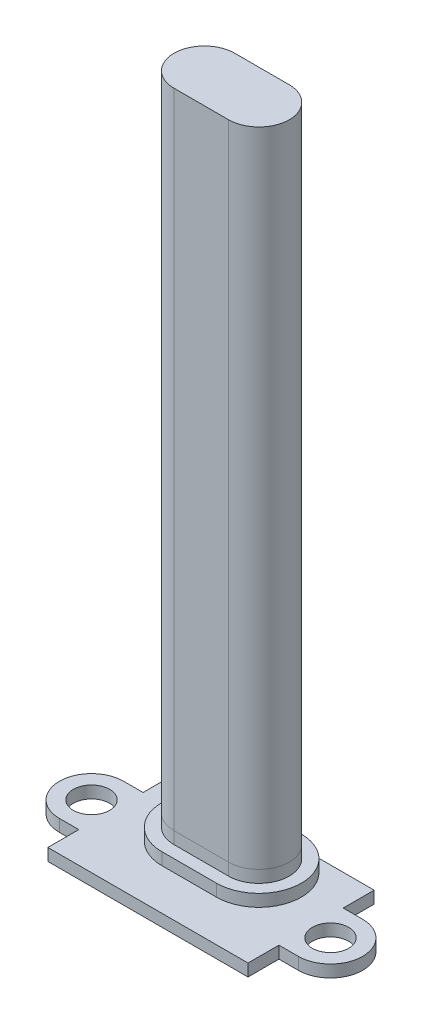
ISO-10303-21;
HEADER;
FILE_DESCRIPTION(('STEP AP214'),'2;1');
FILE_NAME('part.step','',(''),(''),'','','');
FILE_SCHEMA(('AUTOMOTIVE_DESIGN { 1 0 10303 214 1 1 1 1 }'));
ENDSEC;
DATA;
#1=APPLICATION_CONTEXT('core data for automotive mechanical design processes');
#2=APPLICATION_PROTOCOL_DEFINITION('international standard','automotive_design',2000,#1);
#3=PRODUCT_CONTEXT('',#1,'mechanical');
#4=PRODUCT('Part','Part','',(#3));
#5=PRODUCT_RELATED_PRODUCT_CATEGORY('part','',(#4));
#6=PRODUCT_DEFINITION_FORMATION('','',#4);
#7=PRODUCT_DEFINITION_CONTEXT('part definition',#1,'design');
#8=PRODUCT_DEFINITION('design','',#6,#7);
#9=PRODUCT_DEFINITION_SHAPE('','',#8);
#10=(LENGTH_UNIT() NAMED_UNIT(*) SI_UNIT(.MILLI.,.METRE.));
#11=(NAMED_UNIT(*) PLANE_ANGLE_UNIT() SI_UNIT($,.RADIAN.));
#12=(NAMED_UNIT(*) SI_UNIT($,.STERADIAN.) SOLID_ANGLE_UNIT());
#13=UNCERTAINTY_MEASURE_WITH_UNIT(LENGTH_MEASURE(1.E-05),#10,'distance_accuracy_value','');
#14=(GEOMETRIC_REPRESENTATION_CONTEXT(3) GLOBAL_UNCERTAINTY_ASSIGNED_CONTEXT((#13)) GLOBAL_UNIT_ASSIGNED_CONTEXT((#10,
#11,#12)) REPRESENTATION_CONTEXT('',''));
#15=CARTESIAN_POINT('',(0.,0.,0.));
#16=DIRECTION('',(0.,0.,1.));
#17=DIRECTION('',(1.,0.,0.));
#18=AXIS2_PLACEMENT_3D('',#15,#16,#17);
#19=CARTESIAN_POINT('',(-2.25,56.,-6.9));
#20=DIRECTION('',(0.,-1.,0.));
#21=DIRECTION('',(0.,0.,-1.));
#22=AXIS2_PLACEMENT_3D('',#19,#20,#21);
#23=CYLINDRICAL_SURFACE('',#22,2.5);
#24=CARTESIAN_POINT('',(-2.25,3.,-6.9));
#25=DIRECTION('',(0.,1.,0.));
#26=DIRECTION('',(0.,0.,1.));
#27=AXIS2_PLACEMENT_3D('',#24,#25,#26);
#28=CIRCLE('',#27,2.5);
#29=CARTESIAN_POINT('',(-2.25,3.,-9.4));
#30=VERTEX_POINT('',#29);
#31=CARTESIAN_POINT('',(-2.25,3.,-4.4));
#32=VERTEX_POINT('',#31);
#33=EDGE_CURVE('E118',#30,#32,#28,.T.);
#34=ORIENTED_EDGE('',*,*,#33,.T.);
#35=DIRECTION('',(0.,-1.,0.));
#36=VECTOR('',#35,1.);
#37=CARTESIAN_POINT('',(-2.25,56.,-4.4));
#38=LINE('',#37,#36);
#39=CARTESIAN_POINT('',(-2.25,56.,-4.4));
#40=VERTEX_POINT('',#39);
#41=EDGE_CURVE('E12',#40,#32,#38,.T.);
#42=ORIENTED_EDGE('',*,*,#41,.F.);
#43=CARTESIAN_POINT('',(-2.25,56.,-6.9));
#44=DIRECTION('',(0.,1.,0.));
#45=DIRECTION('',(0.,0.,1.));
#46=AXIS2_PLACEMENT_3D('',#43,#44,#45);
#47=CIRCLE('',#46,2.5);
#48=CARTESIAN_POINT('',(-2.25,56.,-9.4));
#49=VERTEX_POINT('',#48);
#50=EDGE_CURVE('E106',#49,#40,#47,.T.);
#51=ORIENTED_EDGE('',*,*,#50,.F.);
#52=DIRECTION('',(0.,-1.,0.));
#53=VECTOR('',#52,1.);
#54=CARTESIAN_POINT('',(-2.25,56.,-9.4));
#55=LINE('',#54,#53);
#56=EDGE_CURVE('E114',#49,#30,#55,.T.);
#57=ORIENTED_EDGE('',*,*,#56,.T.);
#58=EDGE_LOOP('',(#34,#42,#51,#57));
#59=FACE_BOUND('',#58,.T.);
#60=ADVANCED_FACE('F55',(#59),#23,.T.);
#61=CARTESIAN_POINT('',(-2.25,56.,-4.4));
#62=DIRECTION('',(0.,0.,-1.));
#63=DIRECTION('',(-1.,0.,0.));
#64=AXIS2_PLACEMENT_3D('',#61,#62,#63);
#65=PLANE('',#64);
#66=DIRECTION('',(1.,0.,0.));
#67=VECTOR('',#66,1.);
#68=CARTESIAN_POINT('',(-2.25,3.,-4.4));
#69=LINE('',#68,#67);
#70=CARTESIAN_POINT('',(2.25,3.,-4.4));
#71=VERTEX_POINT('',#70);
#72=EDGE_CURVE('E110',#32,#71,#69,.T.);
#73=ORIENTED_EDGE('',*,*,#72,.T.);
#74=DIRECTION('',(0.,-1.,0.));
#75=VECTOR('',#74,1.);
#76=CARTESIAN_POINT('',(2.25,56.,-4.4));
#77=LINE('',#76,#75);
#78=CARTESIAN_POINT('',(2.25,56.,-4.4));
#79=VERTEX_POINT('',#78);
#80=EDGE_CURVE('E63',#79,#71,#77,.T.);
#81=ORIENTED_EDGE('',*,*,#80,.F.);
#82=DIRECTION('',(1.,0.,0.));
#83=VECTOR('',#82,1.);
#84=CARTESIAN_POINT('',(-2.25,56.,-4.4));
#85=LINE('',#84,#83);
#86=EDGE_CURVE('E101',#40,#79,#85,.T.);
#87=ORIENTED_EDGE('',*,*,#86,.F.);
#88=ORIENTED_EDGE('',*,*,#41,.T.);
#89=EDGE_LOOP('',(#73,#81,#87,#88));
#90=FACE_BOUND('',#89,.T.);
#91=ADVANCED_FACE('F109',(#90),#65,.F.);
#92=CARTESIAN_POINT('',(2.25,56.,-6.9));
#93=DIRECTION('',(0.,-1.,0.));
#94=DIRECTION('',(0.,0.,-1.));
#95=AXIS2_PLACEMENT_3D('',#92,#93,#94);
#96=CYLINDRICAL_SURFACE('',#95,2.5);
#97=CARTESIAN_POINT('',(2.25,3.,-6.9));
#98=DIRECTION('',(0.,1.,0.));
#99=DIRECTION('',(0.,0.,1.));
#100=AXIS2_PLACEMENT_3D('',#97,#98,#99);
#101=CIRCLE('',#100,2.5);
#102=CARTESIAN_POINT('',(2.25,3.,-9.4));
#103=VERTEX_POINT('',#102);
#104=EDGE_CURVE('E88',#71,#103,#101,.T.);
#105=ORIENTED_EDGE('',*,*,#104,.T.);
#106=DIRECTION('',(0.,-1.,0.));
#107=VECTOR('',#106,1.);
#108=CARTESIAN_POINT('',(2.25,56.,-9.4));
#109=LINE('',#108,#107);
#110=CARTESIAN_POINT('',(2.25,56.,-9.4));
#111=VERTEX_POINT('',#110);
#112=EDGE_CURVE('E111',#111,#103,#109,.T.);
#113=ORIENTED_EDGE('',*,*,#112,.F.);
#114=CARTESIAN_POINT('',(2.25,56.,-6.9));
#115=DIRECTION('',(0.,1.,0.));
#116=DIRECTION('',(0.,0.,1.));
#117=AXIS2_PLACEMENT_3D('',#114,#115,#116);
#118=CIRCLE('',#117,2.5);
#119=EDGE_CURVE('E104',#79,#111,#118,.T.);
#120=ORIENTED_EDGE('',*,*,#119,.F.);
#121=ORIENTED_EDGE('',*,*,#80,.T.);
#122=EDGE_LOOP('',(#105,#113,#120,#121));
#123=FACE_BOUND('',#122,.T.);
#124=ADVANCED_FACE('F112',(#123),#96,.T.);
#125=CARTESIAN_POINT('',(2.25,56.,-9.4));
#126=DIRECTION('',(0.,0.,1.));
#127=DIRECTION('',(1.,0.,0.));
#128=AXIS2_PLACEMENT_3D('',#125,#126,#127);
#129=PLANE('',#128);
#130=DIRECTION('',(-1.,0.,0.));
#131=VECTOR('',#130,1.);
#132=CARTESIAN_POINT('',(2.25,3.,-9.4));
#133=LINE('',#132,#131);
#134=EDGE_CURVE('E94',#103,#30,#133,.T.);
#135=ORIENTED_EDGE('',*,*,#134,.T.);
#136=ORIENTED_EDGE('',*,*,#56,.F.);
#137=DIRECTION('',(-1.,0.,0.));
#138=VECTOR('',#137,1.);
#139=CARTESIAN_POINT('',(2.25,56.,-9.4));
#140=LINE('',#139,#138);
#141=EDGE_CURVE('E71',#111,#49,#140,.T.);
#142=ORIENTED_EDGE('',*,*,#141,.F.);
#143=ORIENTED_EDGE('',*,*,#112,.T.);
#144=EDGE_LOOP('',(#135,#136,#142,#143));
#145=FACE_BOUND('',#144,.T.);
#146=ADVANCED_FACE('F125',(#145),#129,.F.);
#147=CARTESIAN_POINT('',(-2.25,56.,-6.9));
#148=DIRECTION('',(0.,1.,0.));
#149=DIRECTION('',(0.,0.,1.));
#150=AXIS2_PLACEMENT_3D('',#147,#148,#149);
#151=PLANE('',#150);
#152=ORIENTED_EDGE('',*,*,#50,.T.);
#153=ORIENTED_EDGE('',*,*,#86,.T.);
#154=ORIENTED_EDGE('',*,*,#119,.T.);
#155=ORIENTED_EDGE('',*,*,#141,.T.);
#156=EDGE_LOOP('',(#152,#153,#154,#155));
#157=FACE_BOUND('',#156,.T.);
#158=ADVANCED_FACE('F102',(#157),#151,.T.);
#159=CARTESIAN_POINT('',(-2.25,3.,-6.9));
#160=DIRECTION('',(0.,1.,0.));
#161=DIRECTION('',(0.,0.,1.));
#162=AXIS2_PLACEMENT_3D('',#159,#160,#161);
#163=PLANE('',#162);
#164=ORIENTED_EDGE('',*,*,#33,.F.);
#165=ORIENTED_EDGE('',*,*,#134,.F.);
#166=ORIENTED_EDGE('',*,*,#104,.F.);
#167=ORIENTED_EDGE('',*,*,#72,.F.);
#168=EDGE_LOOP('',(#164,#165,#166,#167));
#169=FACE_BOUND('',#168,.T.);
#170=ADVANCED_FACE('F128',(#169),#163,.F.);
#171=CLOSED_SHELL('',(#60,#91,#124,#146,#158,#170));
#172=MANIFOLD_SOLID_BREP('B2_NOT_SHOWN',#171);
#173=CARTESIAN_POINT('',(-2.25,2.,-6.9));
#174=DIRECTION('',(0.,-1.,0.));
#175=DIRECTION('',(0.,0.,-1.));
#176=AXIS2_PLACEMENT_3D('',#173,#174,#175);
#177=CYLINDRICAL_SURFACE('',#176,3.5);
#178=CARTESIAN_POINT('',(-2.25,1.,-6.9));
#179=DIRECTION('',(0.,1.,0.));
#180=DIRECTION('',(0.,0.,1.));
#181=AXIS2_PLACEMENT_3D('',#178,#179,#180);
#182=CIRCLE('',#181,3.5);
#183=CARTESIAN_POINT('',(-2.25,1.,-10.4));
#184=VERTEX_POINT('',#183);
#185=CARTESIAN_POINT('',(-2.25,1.,-3.4));
#186=VERTEX_POINT('',#185);
#187=EDGE_CURVE('E283',#184,#186,#182,.T.);
#188=ORIENTED_EDGE('',*,*,#187,.T.);
#189=DIRECTION('',(0.,-1.,0.));
#190=VECTOR('',#189,1.);
#191=CARTESIAN_POINT('',(-2.25,2.,-3.4));
#192=LINE('',#191,#190);
#193=CARTESIAN_POINT('',(-2.25,2.,-3.4));
#194=VERTEX_POINT('',#193);
#195=EDGE_CURVE('E53',#194,#186,#192,.T.);
#196=ORIENTED_EDGE('',*,*,#195,.F.);
#197=CARTESIAN_POINT('',(-2.25,2.,-6.9));
#198=DIRECTION('',(0.,1.,0.));
#199=DIRECTION('',(0.,0.,1.));
#200=AXIS2_PLACEMENT_3D('',#197,#198,#199);
#201=CIRCLE('',#200,3.5);
#202=CARTESIAN_POINT('',(-2.25,2.,-10.4));
#203=VERTEX_POINT('',#202);
#204=EDGE_CURVE('E292',#203,#194,#201,.T.);
#205=ORIENTED_EDGE('',*,*,#204,.F.);
#206=DIRECTION('',(0.,-1.,0.));
#207=VECTOR('',#206,1.);
#208=CARTESIAN_POINT('',(-2.25,2.,-10.4));
#209=LINE('',#208,#207);
#210=EDGE_CURVE('E301',#203,#184,#209,.T.);
#211=ORIENTED_EDGE('',*,*,#210,.T.);
#212=EDGE_LOOP('',(#188,#196,#205,#211));
#213=FACE_BOUND('',#212,.T.);
#214=ADVANCED_FACE('F199',(#213),#177,.T.);
#215=CARTESIAN_POINT('',(-2.25,2.,-3.4));
#216=DIRECTION('',(0.,0.,-1.));
#217=DIRECTION('',(-1.,0.,0.));
#218=AXIS2_PLACEMENT_3D('',#215,#216,#217);
#219=PLANE('',#218);
#220=DIRECTION('',(1.,0.,0.));
#221=VECTOR('',#220,1.);
#222=CARTESIAN_POINT('',(-2.25,1.,-3.4));
#223=LINE('',#222,#221);
#224=CARTESIAN_POINT('',(2.25,1.,-3.4));
#225=VERTEX_POINT('',#224);
#226=EDGE_CURVE('E286',#186,#225,#223,.T.);
#227=ORIENTED_EDGE('',*,*,#226,.T.);
#228=DIRECTION('',(0.,-1.,0.));
#229=VECTOR('',#228,1.);
#230=CARTESIAN_POINT('',(2.25,2.,-3.4));
#231=LINE('',#230,#229);
#232=CARTESIAN_POINT('',(2.25,2.,-3.4));
#233=VERTEX_POINT('',#232);
#234=EDGE_CURVE('E206',#233,#225,#231,.T.);
#235=ORIENTED_EDGE('',*,*,#234,.F.);
#236=DIRECTION('',(1.,0.,0.));
#237=VECTOR('',#236,1.);
#238=CARTESIAN_POINT('',(-2.25,2.,-3.4));
#239=LINE('',#238,#237);
#240=EDGE_CURVE('E295',#194,#233,#239,.T.);
#241=ORIENTED_EDGE('',*,*,#240,.F.);
#242=ORIENTED_EDGE('',*,*,#195,.T.);
#243=EDGE_LOOP('',(#227,#235,#241,#242));
#244=FACE_BOUND('',#243,.T.);
#245=ADVANCED_FACE('F332',(#244),#219,.F.);
#246=CARTESIAN_POINT('',(2.25,2.,-6.9));
#247=DIRECTION('',(0.,-1.,0.));
#248=DIRECTION('',(0.,0.,-1.));
#249=AXIS2_PLACEMENT_3D('',#246,#247,#248);
#250=CYLINDRICAL_SURFACE('',#249,3.5);
#251=CARTESIAN_POINT('',(2.25,1.,-6.9));
#252=DIRECTION('',(0.,1.,0.));
#253=DIRECTION('',(0.,0.,1.));
#254=AXIS2_PLACEMENT_3D('',#251,#252,#253);
#255=CIRCLE('',#254,3.5);
#256=CARTESIAN_POINT('',(2.25,1.,-10.4));
#257=VERTEX_POINT('',#256);
#258=EDGE_CURVE('E304',#225,#257,#255,.T.);
#259=ORIENTED_EDGE('',*,*,#258,.T.);
#260=DIRECTION('',(0.,-1.,0.));
#261=VECTOR('',#260,1.);
#262=CARTESIAN_POINT('',(2.25,2.,-10.4));
#263=LINE('',#262,#261);
#264=CARTESIAN_POINT('',(2.25,2.,-10.4));
#265=VERTEX_POINT('',#264);
#266=EDGE_CURVE('E309',#265,#257,#263,.T.);
#267=ORIENTED_EDGE('',*,*,#266,.F.);
#268=CARTESIAN_POINT('',(2.25,2.,-6.9));
#269=DIRECTION('',(0.,1.,0.));
#270=DIRECTION('',(0.,0.,1.));
#271=AXIS2_PLACEMENT_3D('',#268,#269,#270);
#272=CIRCLE('',#271,3.5);
#273=EDGE_CURVE('E298',#233,#265,#272,.T.);
#274=ORIENTED_EDGE('',*,*,#273,.F.);
#275=ORIENTED_EDGE('',*,*,#234,.T.);
#276=EDGE_LOOP('',(#259,#267,#274,#275));
#277=FACE_BOUND('',#276,.T.);
#278=ADVANCED_FACE('F316',(#277),#250,.T.);
#279=CARTESIAN_POINT('',(-2.25,2.,-10.4));
#280=DIRECTION('',(0.,0.,1.));
#281=DIRECTION('',(1.,0.,0.));
#282=AXIS2_PLACEMENT_3D('',#279,#280,#281);
#283=PLANE('',#282);
#284=DIRECTION('',(-1.,0.,0.));
#285=VECTOR('',#284,1.);
#286=CARTESIAN_POINT('',(-2.25,1.,-10.4));
#287=LINE('',#286,#285);
#288=EDGE_CURVE('E296',#257,#184,#287,.T.);
#289=ORIENTED_EDGE('',*,*,#288,.T.);
#290=ORIENTED_EDGE('',*,*,#210,.F.);
#291=DIRECTION('',(-1.,0.,0.));
#292=VECTOR('',#291,1.);
#293=CARTESIAN_POINT('',(-2.25,2.,-10.4));
#294=LINE('',#293,#292);
#295=EDGE_CURVE('E300',#265,#203,#294,.T.);
#296=ORIENTED_EDGE('',*,*,#295,.F.);
#297=ORIENTED_EDGE('',*,*,#266,.T.);
#298=EDGE_LOOP('',(#289,#290,#296,#297));
#299=FACE_BOUND('',#298,.T.);
#300=ADVANCED_FACE('F325',(#299),#283,.F.);
#301=CARTESIAN_POINT('',(-2.25,2.,-6.9));
#302=DIRECTION('',(0.,1.,0.));
#303=DIRECTION('',(0.,0.,1.));
#304=AXIS2_PLACEMENT_3D('',#301,#302,#303);
#305=PLANE('',#304);
#306=CARTESIAN_POINT('',(-2.25,2.,-6.9));
#307=DIRECTION('',(0.,1.,0.));
#308=DIRECTION('',(0.,0.,1.));
#309=AXIS2_PLACEMENT_3D('',#306,#307,#308);
#310=CIRCLE('',#309,2.5);
#311=CARTESIAN_POINT('',(-2.25,2.,-9.4));
#312=VERTEX_POINT('',#311);
#313=CARTESIAN_POINT('',(-2.25,2.,-4.4));
#314=VERTEX_POINT('',#313);
#315=EDGE_CURVE('E213',#312,#314,#310,.T.);
#316=ORIENTED_EDGE('',*,*,#315,.F.);
#317=DIRECTION('',(-1.,0.,0.));
#318=VECTOR('',#317,1.);
#319=CARTESIAN_POINT('',(2.25,2.,-9.4));
#320=LINE('',#319,#318);
#321=CARTESIAN_POINT('',(2.25,2.,-9.4));
#322=VERTEX_POINT('',#321);
#323=EDGE_CURVE('E217',#322,#312,#320,.T.);
#324=ORIENTED_EDGE('',*,*,#323,.F.);
#325=CARTESIAN_POINT('',(2.25,2.,-6.9));
#326=DIRECTION('',(0.,1.,0.));
#327=DIRECTION('',(0.,0.,1.));
#328=AXIS2_PLACEMENT_3D('',#325,#326,#327);
#329=CIRCLE('',#328,2.5);
#330=CARTESIAN_POINT('',(2.25,2.,-4.4));
#331=VERTEX_POINT('',#330);
#332=EDGE_CURVE('E448',#331,#322,#329,.T.);
#333=ORIENTED_EDGE('',*,*,#332,.F.);
#334=DIRECTION('',(1.,0.,0.));
#335=VECTOR('',#334,1.);
#336=CARTESIAN_POINT('',(-2.25,2.,-4.4));
#337=LINE('',#336,#335);
#338=EDGE_CURVE('E454',#314,#331,#337,.T.);
#339=ORIENTED_EDGE('',*,*,#338,.F.);
#340=EDGE_LOOP('',(#316,#324,#333,#339));
#341=FACE_BOUND('',#340,.T.);
#342=ORIENTED_EDGE('',*,*,#204,.T.);
#343=ORIENTED_EDGE('',*,*,#240,.T.);
#344=ORIENTED_EDGE('',*,*,#273,.T.);
#345=ORIENTED_EDGE('',*,*,#295,.T.);
#346=EDGE_LOOP('',(#342,#343,#344,#345));
#347=FACE_BOUND('',#346,.T.);
#348=ADVANCED_FACE('F331',(#341,#347),#305,.T.);
#349=CARTESIAN_POINT('',(-2.25,1.,-6.9));
#350=DIRECTION('',(0.,1.,0.));
#351=DIRECTION('',(0.,0.,1.));
#352=AXIS2_PLACEMENT_3D('',#349,#350,#351);
#353=PLANE('',#352);
#354=ORIENTED_EDGE('',*,*,#187,.F.);
#355=ORIENTED_EDGE('',*,*,#288,.F.);
#356=ORIENTED_EDGE('',*,*,#258,.F.);
#357=ORIENTED_EDGE('',*,*,#226,.F.);
#358=EDGE_LOOP('',(#354,#355,#356,#357));
#359=FACE_BOUND('',#358,.T.);
#360=ADVANCED_FACE('F322',(#359),#353,.F.);
#361=CARTESIAN_POINT('',(-2.25,3.,-6.9));
#362=DIRECTION('',(0.,-1.,0.));
#363=DIRECTION('',(0.,0.,-1.));
#364=AXIS2_PLACEMENT_3D('',#361,#362,#363);
#365=CYLINDRICAL_SURFACE('',#364,2.5);
#366=ORIENTED_EDGE('',*,*,#315,.T.);
#367=DIRECTION('',(0.,-1.,0.));
#368=VECTOR('',#367,1.);
#369=CARTESIAN_POINT('',(-2.25,3.,-4.4));
#370=LINE('',#369,#368);
#371=CARTESIAN_POINT('',(-2.25,3.,-4.4));
#372=VERTEX_POINT('',#371);
#373=EDGE_CURVE('E266',#372,#314,#370,.T.);
#374=ORIENTED_EDGE('',*,*,#373,.F.);
#375=CARTESIAN_POINT('',(-2.25,3.,-6.9));
#376=DIRECTION('',(0.,1.,0.));
#377=DIRECTION('',(0.,0.,1.));
#378=AXIS2_PLACEMENT_3D('',#375,#376,#377);
#379=CIRCLE('',#378,2.5);
#380=CARTESIAN_POINT('',(-2.25,3.,-9.4));
#381=VERTEX_POINT('',#380);
#382=EDGE_CURVE('E272',#381,#372,#379,.T.);
#383=ORIENTED_EDGE('',*,*,#382,.F.);
#384=DIRECTION('',(0.,-1.,0.));
#385=VECTOR('',#384,1.);
#386=CARTESIAN_POINT('',(-2.25,3.,-9.4));
#387=LINE('',#386,#385);
#388=EDGE_CURVE('E446',#381,#312,#387,.T.);
#389=ORIENTED_EDGE('',*,*,#388,.T.);
#390=EDGE_LOOP('',(#366,#374,#383,#389));
#391=FACE_BOUND('',#390,.T.);
#392=ADVANCED_FACE('F282',(#391),#365,.T.);
#393=CARTESIAN_POINT('',(-2.25,3.,-4.4));
#394=DIRECTION('',(0.,0.,-1.));
#395=DIRECTION('',(-1.,0.,0.));
#396=AXIS2_PLACEMENT_3D('',#393,#394,#395);
#397=PLANE('',#396);
#398=ORIENTED_EDGE('',*,*,#338,.T.);
#399=DIRECTION('',(0.,-1.,0.));
#400=VECTOR('',#399,1.);
#401=CARTESIAN_POINT('',(2.25,3.,-4.4));
#402=LINE('',#401,#400);
#403=CARTESIAN_POINT('',(2.25,3.,-4.4));
#404=VERTEX_POINT('',#403);
#405=EDGE_CURVE('E268',#404,#331,#402,.T.);
#406=ORIENTED_EDGE('',*,*,#405,.F.);
#407=DIRECTION('',(1.,0.,0.));
#408=VECTOR('',#407,1.);
#409=CARTESIAN_POINT('',(-2.25,3.,-4.4));
#410=LINE('',#409,#408);
#411=EDGE_CURVE('E261',#372,#404,#410,.T.);
#412=ORIENTED_EDGE('',*,*,#411,.F.);
#413=ORIENTED_EDGE('',*,*,#373,.T.);
#414=EDGE_LOOP('',(#398,#406,#412,#413));
#415=FACE_BOUND('',#414,.T.);
#416=ADVANCED_FACE('F264',(#415),#397,.F.);
#417=CARTESIAN_POINT('',(2.25,3.,-6.9));
#418=DIRECTION('',(0.,-1.,0.));
#419=DIRECTION('',(0.,0.,-1.));
#420=AXIS2_PLACEMENT_3D('',#417,#418,#419);
#421=CYLINDRICAL_SURFACE('',#420,2.5);
#422=ORIENTED_EDGE('',*,*,#332,.T.);
#423=DIRECTION('',(0.,-1.,0.));
#424=VECTOR('',#423,1.);
#425=CARTESIAN_POINT('',(2.25,3.,-9.4));
#426=LINE('',#425,#424);
#427=CARTESIAN_POINT('',(2.25,3.,-9.4));
#428=VERTEX_POINT('',#427);
#429=EDGE_CURVE('E288',#428,#322,#426,.T.);
#430=ORIENTED_EDGE('',*,*,#429,.F.);
#431=CARTESIAN_POINT('',(2.25,3.,-6.9));
#432=DIRECTION('',(0.,1.,0.));
#433=DIRECTION('',(0.,0.,1.));
#434=AXIS2_PLACEMENT_3D('',#431,#432,#433);
#435=CIRCLE('',#434,2.5);
#436=EDGE_CURVE('E271',#404,#428,#435,.T.);
#437=ORIENTED_EDGE('',*,*,#436,.F.);
#438=ORIENTED_EDGE('',*,*,#405,.T.);
#439=EDGE_LOOP('',(#422,#430,#437,#438));
#440=FACE_BOUND('',#439,.T.);
#441=ADVANCED_FACE('F350',(#440),#421,.T.);
#442=CARTESIAN_POINT('',(2.25,3.,-9.4));
#443=DIRECTION('',(0.,0.,1.));
#444=DIRECTION('',(1.,0.,0.));
#445=AXIS2_PLACEMENT_3D('',#442,#443,#444);
#446=PLANE('',#445);
#447=ORIENTED_EDGE('',*,*,#323,.T.);
#448=ORIENTED_EDGE('',*,*,#388,.F.);
#449=DIRECTION('',(-1.,0.,0.));
#450=VECTOR('',#449,1.);
#451=CARTESIAN_POINT('',(2.25,3.,-9.4));
#452=LINE('',#451,#450);
#453=EDGE_CURVE('E277',#428,#381,#452,.T.);
#454=ORIENTED_EDGE('',*,*,#453,.F.);
#455=ORIENTED_EDGE('',*,*,#429,.T.);
#456=EDGE_LOOP('',(#447,#448,#454,#455));
#457=FACE_BOUND('',#456,.T.);
#458=ADVANCED_FACE('F353',(#457),#446,.F.);
#459=CARTESIAN_POINT('',(-2.25,3.,-6.9));
#460=DIRECTION('',(0.,1.,0.));
#461=DIRECTION('',(0.,0.,1.));
#462=AXIS2_PLACEMENT_3D('',#459,#460,#461);
#463=PLANE('',#462);
#464=ORIENTED_EDGE('',*,*,#382,.T.);
#465=ORIENTED_EDGE('',*,*,#411,.T.);
#466=ORIENTED_EDGE('',*,*,#436,.T.);
#467=ORIENTED_EDGE('',*,*,#453,.T.);
#468=EDGE_LOOP('',(#464,#465,#466,#467));
#469=FACE_BOUND('',#468,.T.);
#470=ADVANCED_FACE('F275',(#469),#463,.T.);
#471=CLOSED_SHELL('',(#214,#245,#278,#300,#348,#360,#392,#416,#441,#458,#470));
#472=MANIFOLD_SOLID_BREP('B6',#471);
#473=CARTESIAN_POINT('',(-9.85,1.,-5.2));
#474=DIRECTION('',(0.,1.,0.));
#475=DIRECTION('',(0.,0.,1.));
#476=AXIS2_PLACEMENT_3D('',#473,#474,#475);
#477=PLANE('',#476);
#478=CARTESIAN_POINT('',(9.85,1.,-5.2));
#479=DIRECTION('',(0.,1.,0.));
#480=DIRECTION('',(0.,0.,1.));
#481=AXIS2_PLACEMENT_3D('',#478,#479,#480);
#482=CIRCLE('',#481,1.5);
#483=CARTESIAN_POINT('',(9.85,1.,-3.7));
#484=VERTEX_POINT('',#483);
#485=EDGE_CURVE('E584',#484,#484,#482,.T.);
#486=ORIENTED_EDGE('',*,*,#485,.F.);
#487=EDGE_LOOP('',(#486));
#488=FACE_BOUND('',#487,.T.);
#489=DIRECTION('',(0.,0.,1.));
#490=VECTOR('',#489,1.);
#491=CARTESIAN_POINT('',(-8.25,1.,0.));
#492=LINE('',#491,#490);
#493=CARTESIAN_POINT('',(-8.25,1.,-2.55));
#494=VERTEX_POINT('',#493);
#495=CARTESIAN_POINT('',(-8.25,1.,0.));
#496=VERTEX_POINT('',#495);
#497=EDGE_CURVE('E603',#494,#496,#492,.T.);
#498=ORIENTED_EDGE('',*,*,#497,.T.);
#499=DIRECTION('',(1.,0.,0.));
#500=VECTOR('',#499,1.);
#501=CARTESIAN_POINT('',(-8.25,1.,0.));
#502=LINE('',#501,#500);
#503=CARTESIAN_POINT('',(8.25,1.,0.));
#504=VERTEX_POINT('',#503);
#505=EDGE_CURVE('E531',#496,#504,#502,.T.);
#506=ORIENTED_EDGE('',*,*,#505,.T.);
#507=DIRECTION('',(0.,0.,-1.));
#508=VECTOR('',#507,1.);
#509=CARTESIAN_POINT('',(8.25,1.,0.));
#510=LINE('',#509,#508);
#511=CARTESIAN_POINT('',(8.25,1.,-2.55));
#512=VERTEX_POINT('',#511);
#513=EDGE_CURVE('E630',#504,#512,#510,.T.);
#514=ORIENTED_EDGE('',*,*,#513,.T.);
#515=DIRECTION('',(1.,0.,0.));
#516=VECTOR('',#515,1.);
#517=CARTESIAN_POINT('',(8.25,1.,-2.55));
#518=LINE('',#517,#516);
#519=CARTESIAN_POINT('',(9.85,1.,-2.55));
#520=VERTEX_POINT('',#519);
#521=EDGE_CURVE('E649',#512,#520,#518,.T.);
#522=ORIENTED_EDGE('',*,*,#521,.T.);
#523=CARTESIAN_POINT('',(9.85,1.,-5.2));
#524=DIRECTION('',(0.,1.,0.));
#525=DIRECTION('',(0.,0.,1.));
#526=AXIS2_PLACEMENT_3D('',#523,#524,#525);
#527=CIRCLE('',#526,2.65);
#528=CARTESIAN_POINT('',(9.85,1.,-7.85));
#529=VERTEX_POINT('',#528);
#530=EDGE_CURVE('E646',#520,#529,#527,.T.);
#531=ORIENTED_EDGE('',*,*,#530,.T.);
#532=DIRECTION('',(-1.,0.,0.));
#533=VECTOR('',#532,1.);
#534=CARTESIAN_POINT('',(8.25,1.,-7.85));
#535=LINE('',#534,#533);
#536=CARTESIAN_POINT('',(8.25,1.,-7.85));
#537=VERTEX_POINT('',#536);
#538=EDGE_CURVE('E648',#529,#537,#535,.T.);
#539=ORIENTED_EDGE('',*,*,#538,.T.);
#540=DIRECTION('',(0.,0.,-1.));
#541=VECTOR('',#540,1.);
#542=CARTESIAN_POINT('',(8.25,1.,-7.85));
#543=LINE('',#542,#541);
#544=CARTESIAN_POINT('',(8.25,1.,-10.4));
#545=VERTEX_POINT('',#544);
#546=EDGE_CURVE('E651',#537,#545,#543,.T.);
#547=ORIENTED_EDGE('',*,*,#546,.T.);
#548=DIRECTION('',(-1.,0.,0.));
#549=VECTOR('',#548,1.);
#550=CARTESIAN_POINT('',(-8.25,1.,-10.4));
#551=LINE('',#550,#549);
#552=CARTESIAN_POINT('',(-8.25,1.,-10.4));
#553=VERTEX_POINT('',#552);
#554=EDGE_CURVE('E657',#545,#553,#551,.T.);
#555=ORIENTED_EDGE('',*,*,#554,.T.);
#556=DIRECTION('',(0.,0.,1.));
#557=VECTOR('',#556,1.);
#558=CARTESIAN_POINT('',(-8.25,1.,-7.85));
#559=LINE('',#558,#557);
#560=CARTESIAN_POINT('',(-8.25,1.,-7.85));
#561=VERTEX_POINT('',#560);
#562=EDGE_CURVE('E562',#553,#561,#559,.T.);
#563=ORIENTED_EDGE('',*,*,#562,.T.);
#564=DIRECTION('',(-1.,0.,0.));
#565=VECTOR('',#564,1.);
#566=CARTESIAN_POINT('',(-9.85,1.,-7.85));
#567=LINE('',#566,#565);
#568=CARTESIAN_POINT('',(-9.85,1.,-7.85));
#569=VERTEX_POINT('',#568);
#570=EDGE_CURVE('E556',#561,#569,#567,.T.);
#571=ORIENTED_EDGE('',*,*,#570,.T.);
#572=CARTESIAN_POINT('',(-9.85,1.,-5.2));
#573=DIRECTION('',(0.,1.,0.));
#574=DIRECTION('',(0.,0.,1.));
#575=AXIS2_PLACEMENT_3D('',#572,#573,#574);
#576=CIRCLE('',#575,2.65);
#577=CARTESIAN_POINT('',(-9.85,1.,-2.55));
#578=VERTEX_POINT('',#577);
#579=EDGE_CURVE('E560',#569,#578,#576,.T.);
#580=ORIENTED_EDGE('',*,*,#579,.T.);
#581=DIRECTION('',(1.,0.,0.));
#582=VECTOR('',#581,1.);
#583=CARTESIAN_POINT('',(-9.85,1.,-2.55));
#584=LINE('',#583,#582);
#585=EDGE_CURVE('E476',#578,#494,#584,.T.);
#586=ORIENTED_EDGE('',*,*,#585,.T.);
#587=EDGE_LOOP('',(#498,#506,#514,#522,#531,#539,#547,#555,#563,#571,#580,#586));
#588=FACE_BOUND('',#587,.T.);
#589=CARTESIAN_POINT('',(-9.85,1.,-5.2));
#590=DIRECTION('',(0.,1.,0.));
#591=DIRECTION('',(0.,0.,1.));
#592=AXIS2_PLACEMENT_3D('',#589,#590,#591);
#593=CIRCLE('',#592,1.5);
#594=CARTESIAN_POINT('',(-9.85,1.,-3.7));
#595=VERTEX_POINT('',#594);
#596=EDGE_CURVE('E699',#595,#595,#593,.T.);
#597=ORIENTED_EDGE('',*,*,#596,.F.);
#598=EDGE_LOOP('',(#597));
#599=FACE_BOUND('',#598,.T.);
#600=ADVANCED_FACE('F459',(#488,#588,#599),#477,.T.);
#601=CARTESIAN_POINT('',(-9.85,0.,-5.2));
#602=DIRECTION('',(0.,1.,0.));
#603=DIRECTION('',(0.,0.,1.));
#604=AXIS2_PLACEMENT_3D('',#601,#602,#603);
#605=PLANE('',#604);
#606=DIRECTION('',(0.,0.,1.));
#607=VECTOR('',#606,1.);
#608=CARTESIAN_POINT('',(-8.25,0.,0.));
#609=LINE('',#608,#607);
#610=CARTESIAN_POINT('',(-8.25,0.,-2.55));
#611=VERTEX_POINT('',#610);
#612=CARTESIAN_POINT('',(-8.25,0.,0.));
#613=VERTEX_POINT('',#612);
#614=EDGE_CURVE('E580',#611,#613,#609,.T.);
#615=ORIENTED_EDGE('',*,*,#614,.F.);
#616=DIRECTION('',(1.,0.,0.));
#617=VECTOR('',#616,1.);
#618=CARTESIAN_POINT('',(-9.85,0.,-2.55));
#619=LINE('',#618,#617);
#620=CARTESIAN_POINT('',(-9.85,0.,-2.55));
#621=VERTEX_POINT('',#620);
#622=EDGE_CURVE('E523',#621,#611,#619,.T.);
#623=ORIENTED_EDGE('',*,*,#622,.F.);
#624=CARTESIAN_POINT('',(-9.85,0.,-5.2));
#625=DIRECTION('',(0.,1.,0.));
#626=DIRECTION('',(0.,0.,1.));
#627=AXIS2_PLACEMENT_3D('',#624,#625,#626);
#628=CIRCLE('',#627,2.65);
#629=CARTESIAN_POINT('',(-9.85,0.,-7.85));
#630=VERTEX_POINT('',#629);
#631=EDGE_CURVE('E517',#630,#621,#628,.T.);
#632=ORIENTED_EDGE('',*,*,#631,.F.);
#633=DIRECTION('',(-1.,0.,0.));
#634=VECTOR('',#633,1.);
#635=CARTESIAN_POINT('',(-9.85,0.,-7.85));
#636=LINE('',#635,#634);
#637=CARTESIAN_POINT('',(-8.25,0.,-7.85));
#638=VERTEX_POINT('',#637);
#639=EDGE_CURVE('E570',#638,#630,#636,.T.);
#640=ORIENTED_EDGE('',*,*,#639,.F.);
#641=DIRECTION('',(0.,0.,1.));
#642=VECTOR('',#641,1.);
#643=CARTESIAN_POINT('',(-8.25,0.,-7.85));
#644=LINE('',#643,#642);
#645=CARTESIAN_POINT('',(-8.25,0.,-10.4));
#646=VERTEX_POINT('',#645);
#647=EDGE_CURVE('E598',#646,#638,#644,.T.);
#648=ORIENTED_EDGE('',*,*,#647,.F.);
#649=DIRECTION('',(-1.,0.,0.));
#650=VECTOR('',#649,1.);
#651=CARTESIAN_POINT('',(-8.25,0.,-10.4));
#652=LINE('',#651,#650);
#653=CARTESIAN_POINT('',(8.25,0.,-10.4));
#654=VERTEX_POINT('',#653);
#655=EDGE_CURVE('E596',#654,#646,#652,.T.);
#656=ORIENTED_EDGE('',*,*,#655,.F.);
#657=DIRECTION('',(0.,0.,-1.));
#658=VECTOR('',#657,1.);
#659=CARTESIAN_POINT('',(8.25,0.,-7.85));
#660=LINE('',#659,#658);
#661=CARTESIAN_POINT('',(8.25,0.,-7.85));
#662=VERTEX_POINT('',#661);
#663=EDGE_CURVE('E594',#662,#654,#660,.T.);
#664=ORIENTED_EDGE('',*,*,#663,.F.);
#665=DIRECTION('',(-1.,0.,0.));
#666=VECTOR('',#665,1.);
#667=CARTESIAN_POINT('',(8.25,0.,-7.85));
#668=LINE('',#667,#666);
#669=CARTESIAN_POINT('',(9.85,0.,-7.85));
#670=VERTEX_POINT('',#669);
#671=EDGE_CURVE('E592',#670,#662,#668,.T.);
#672=ORIENTED_EDGE('',*,*,#671,.F.);
#673=CARTESIAN_POINT('',(9.85,0.,-5.2));
#674=DIRECTION('',(0.,1.,0.));
#675=DIRECTION('',(0.,0.,1.));
#676=AXIS2_PLACEMENT_3D('',#673,#674,#675);
#677=CIRCLE('',#676,2.65);
#678=CARTESIAN_POINT('',(9.85,0.,-2.55));
#679=VERTEX_POINT('',#678);
#680=EDGE_CURVE('E590',#679,#670,#677,.T.);
#681=ORIENTED_EDGE('',*,*,#680,.F.);
#682=DIRECTION('',(1.,0.,0.));
#683=VECTOR('',#682,1.);
#684=CARTESIAN_POINT('',(8.25,0.,-2.55));
#685=LINE('',#684,#683);
#686=CARTESIAN_POINT('',(8.25,0.,-2.55));
#687=VERTEX_POINT('',#686);
#688=EDGE_CURVE('E588',#687,#679,#685,.T.);
#689=ORIENTED_EDGE('',*,*,#688,.F.);
#690=DIRECTION('',(0.,0.,-1.));
#691=VECTOR('',#690,1.);
#692=CARTESIAN_POINT('',(8.25,0.,0.));
#693=LINE('',#692,#691);
#694=CARTESIAN_POINT('',(8.25,0.,0.));
#695=VERTEX_POINT('',#694);
#696=EDGE_CURVE('E586',#695,#687,#693,.T.);
#697=ORIENTED_EDGE('',*,*,#696,.F.);
#698=DIRECTION('',(1.,0.,0.));
#699=VECTOR('',#698,1.);
#700=CARTESIAN_POINT('',(-8.25,0.,0.));
#701=LINE('',#700,#699);
#702=EDGE_CURVE('E583',#613,#695,#701,.T.);
#703=ORIENTED_EDGE('',*,*,#702,.F.);
#704=EDGE_LOOP('',(#615,#623,#632,#640,#648,#656,#664,#672,#681,#689,#697,#703));
#705=FACE_BOUND('',#704,.T.);
#706=CARTESIAN_POINT('',(9.85,0.,-5.2));
#707=DIRECTION('',(0.,1.,0.));
#708=DIRECTION('',(0.,0.,1.));
#709=AXIS2_PLACEMENT_3D('',#706,#707,#708);
#710=CIRCLE('',#709,1.5);
#711=CARTESIAN_POINT('',(9.85,0.,-3.7));
#712=VERTEX_POINT('',#711);
#713=EDGE_CURVE('E705',#712,#712,#710,.T.);
#714=ORIENTED_EDGE('',*,*,#713,.T.);
#715=EDGE_LOOP('',(#714));
#716=FACE_BOUND('',#715,.T.);
#717=CARTESIAN_POINT('',(-9.85,0.,-5.2));
#718=DIRECTION('',(0.,1.,0.));
#719=DIRECTION('',(0.,0.,1.));
#720=AXIS2_PLACEMENT_3D('',#717,#718,#719);
#721=CIRCLE('',#720,1.5);
#722=CARTESIAN_POINT('',(-9.85,0.,-3.7));
#723=VERTEX_POINT('',#722);
#724=EDGE_CURVE('E702',#723,#723,#721,.T.);
#725=ORIENTED_EDGE('',*,*,#724,.T.);
#726=EDGE_LOOP('',(#725));
#727=FACE_BOUND('',#726,.T.);
#728=ADVANCED_FACE('F634',(#705,#716,#727),#605,.F.);
#729=CARTESIAN_POINT('',(-8.25,1.,0.));
#730=DIRECTION('',(1.,0.,0.));
#731=DIRECTION('',(0.,0.,-1.));
#732=AXIS2_PLACEMENT_3D('',#729,#730,#731);
#733=PLANE('',#732);
#734=ORIENTED_EDGE('',*,*,#614,.T.);
#735=DIRECTION('',(0.,-1.,0.));
#736=VECTOR('',#735,1.);
#737=CARTESIAN_POINT('',(-8.25,1.,0.));
#738=LINE('',#737,#736);
#739=EDGE_CURVE('E197',#496,#613,#738,.T.);
#740=ORIENTED_EDGE('',*,*,#739,.F.);
#741=ORIENTED_EDGE('',*,*,#497,.F.);
#742=DIRECTION('',(0.,-1.,0.));
#743=VECTOR('',#742,1.);
#744=CARTESIAN_POINT('',(-8.25,1.,-2.55));
#745=LINE('',#744,#743);
#746=EDGE_CURVE('E576',#494,#611,#745,.T.);
#747=ORIENTED_EDGE('',*,*,#746,.T.);
#748=EDGE_LOOP('',(#734,#740,#741,#747));
#749=FACE_BOUND('',#748,.T.);
#750=ADVANCED_FACE('F461',(#749),#733,.F.);
#751=CARTESIAN_POINT('',(-8.25,1.,0.));
#752=DIRECTION('',(0.,0.,-1.));
#753=DIRECTION('',(-1.,0.,0.));
#754=AXIS2_PLACEMENT_3D('',#751,#752,#753);
#755=PLANE('',#754);
#756=ORIENTED_EDGE('',*,*,#702,.T.);
#757=DIRECTION('',(0.,-1.,0.));
#758=VECTOR('',#757,1.);
#759=CARTESIAN_POINT('',(8.25,1.,0.));
#760=LINE('',#759,#758);
#761=EDGE_CURVE('E468',#504,#695,#760,.T.);
#762=ORIENTED_EDGE('',*,*,#761,.F.);
#763=ORIENTED_EDGE('',*,*,#505,.F.);
#764=ORIENTED_EDGE('',*,*,#739,.T.);
#765=EDGE_LOOP('',(#756,#762,#763,#764));
#766=FACE_BOUND('',#765,.T.);
#767=ADVANCED_FACE('F808',(#766),#755,.F.);
#768=CARTESIAN_POINT('',(8.25,1.,0.));
#769=DIRECTION('',(-1.,0.,0.));
#770=DIRECTION('',(0.,0.,1.));
#771=AXIS2_PLACEMENT_3D('',#768,#769,#770);
#772=PLANE('',#771);
#773=ORIENTED_EDGE('',*,*,#696,.T.);
#774=DIRECTION('',(0.,-1.,0.));
#775=VECTOR('',#774,1.);
#776=CARTESIAN_POINT('',(8.25,1.,-2.55));
#777=LINE('',#776,#775);
#778=EDGE_CURVE('E622',#512,#687,#777,.T.);
#779=ORIENTED_EDGE('',*,*,#778,.F.);
#780=ORIENTED_EDGE('',*,*,#513,.F.);
#781=ORIENTED_EDGE('',*,*,#761,.T.);
#782=EDGE_LOOP('',(#773,#779,#780,#781));
#783=FACE_BOUND('',#782,.T.);
#784=ADVANCED_FACE('F628',(#783),#772,.F.);
#785=CARTESIAN_POINT('',(8.25,1.,-2.55));
#786=DIRECTION('',(0.,0.,-1.));
#787=DIRECTION('',(-1.,0.,0.));
#788=AXIS2_PLACEMENT_3D('',#785,#786,#787);
#789=PLANE('',#788);
#790=ORIENTED_EDGE('',*,*,#688,.T.);
#791=DIRECTION('',(0.,-1.,0.));
#792=VECTOR('',#791,1.);
#793=CARTESIAN_POINT('',(9.85,1.,-2.55));
#794=LINE('',#793,#792);
#795=EDGE_CURVE('E619',#520,#679,#794,.T.);
#796=ORIENTED_EDGE('',*,*,#795,.F.);
#797=ORIENTED_EDGE('',*,*,#521,.F.);
#798=ORIENTED_EDGE('',*,*,#778,.T.);
#799=EDGE_LOOP('',(#790,#796,#797,#798));
#800=FACE_BOUND('',#799,.T.);
#801=ADVANCED_FACE('F640',(#800),#789,.F.);
#802=CARTESIAN_POINT('',(9.85,1.,-5.2));
#803=DIRECTION('',(0.,-1.,0.));
#804=DIRECTION('',(0.,0.,-1.));
#805=AXIS2_PLACEMENT_3D('',#802,#803,#804);
#806=CYLINDRICAL_SURFACE('',#805,2.65);
#807=ORIENTED_EDGE('',*,*,#680,.T.);
#808=DIRECTION('',(0.,-1.,0.));
#809=VECTOR('',#808,1.);
#810=CARTESIAN_POINT('',(9.85,1.,-7.85));
#811=LINE('',#810,#809);
#812=EDGE_CURVE('E616',#529,#670,#811,.T.);
#813=ORIENTED_EDGE('',*,*,#812,.F.);
#814=ORIENTED_EDGE('',*,*,#530,.F.);
#815=ORIENTED_EDGE('',*,*,#795,.T.);
#816=EDGE_LOOP('',(#807,#813,#814,#815));
#817=FACE_BOUND('',#816,.T.);
#818=ADVANCED_FACE('F644',(#817),#806,.T.);
#819=CARTESIAN_POINT('',(8.25,1.,-7.85));
#820=DIRECTION('',(0.,0.,1.));
#821=DIRECTION('',(1.,0.,0.));
#822=AXIS2_PLACEMENT_3D('',#819,#820,#821);
#823=PLANE('',#822);
#824=ORIENTED_EDGE('',*,*,#671,.T.);
#825=DIRECTION('',(0.,-1.,0.));
#826=VECTOR('',#825,1.);
#827=CARTESIAN_POINT('',(8.25,1.,-7.85));
#828=LINE('',#827,#826);
#829=EDGE_CURVE('E613',#537,#662,#828,.T.);
#830=ORIENTED_EDGE('',*,*,#829,.F.);
#831=ORIENTED_EDGE('',*,*,#538,.F.);
#832=ORIENTED_EDGE('',*,*,#812,.T.);
#833=EDGE_LOOP('',(#824,#830,#831,#832));
#834=FACE_BOUND('',#833,.T.);
#835=ADVANCED_FACE('F769',(#834),#823,.F.);
#836=CARTESIAN_POINT('',(8.25,1.,-7.85));
#837=DIRECTION('',(-1.,0.,0.));
#838=DIRECTION('',(0.,0.,1.));
#839=AXIS2_PLACEMENT_3D('',#836,#837,#838);
#840=PLANE('',#839);
#841=ORIENTED_EDGE('',*,*,#663,.T.);
#842=DIRECTION('',(0.,-1.,0.));
#843=VECTOR('',#842,1.);
#844=CARTESIAN_POINT('',(8.25,1.,-10.4));
#845=LINE('',#844,#843);
#846=EDGE_CURVE('E610',#545,#654,#845,.T.);
#847=ORIENTED_EDGE('',*,*,#846,.F.);
#848=ORIENTED_EDGE('',*,*,#546,.F.);
#849=ORIENTED_EDGE('',*,*,#829,.T.);
#850=EDGE_LOOP('',(#841,#847,#848,#849));
#851=FACE_BOUND('',#850,.T.);
#852=ADVANCED_FACE('F759',(#851),#840,.F.);
#853=CARTESIAN_POINT('',(-8.25,1.,-10.4));
#854=DIRECTION('',(0.,0.,1.));
#855=DIRECTION('',(1.,0.,0.));
#856=AXIS2_PLACEMENT_3D('',#853,#854,#855);
#857=PLANE('',#856);
#858=ORIENTED_EDGE('',*,*,#655,.T.);
#859=DIRECTION('',(0.,-1.,0.));
#860=VECTOR('',#859,1.);
#861=CARTESIAN_POINT('',(-8.25,1.,-10.4));
#862=LINE('',#861,#860);
#863=EDGE_CURVE('E607',#553,#646,#862,.T.);
#864=ORIENTED_EDGE('',*,*,#863,.F.);
#865=ORIENTED_EDGE('',*,*,#554,.F.);
#866=ORIENTED_EDGE('',*,*,#846,.T.);
#867=EDGE_LOOP('',(#858,#864,#865,#866));
#868=FACE_BOUND('',#867,.T.);
#869=ADVANCED_FACE('F663',(#868),#857,.F.);
#870=CARTESIAN_POINT('',(-8.25,1.,-7.85));
#871=DIRECTION('',(1.,0.,0.));
#872=DIRECTION('',(0.,0.,-1.));
#873=AXIS2_PLACEMENT_3D('',#870,#871,#872);
#874=PLANE('',#873);
#875=ORIENTED_EDGE('',*,*,#647,.T.);
#876=DIRECTION('',(0.,-1.,0.));
#877=VECTOR('',#876,1.);
#878=CARTESIAN_POINT('',(-8.25,1.,-7.85));
#879=LINE('',#878,#877);
#880=EDGE_CURVE('E571',#561,#638,#879,.T.);
#881=ORIENTED_EDGE('',*,*,#880,.F.);
#882=ORIENTED_EDGE('',*,*,#562,.F.);
#883=ORIENTED_EDGE('',*,*,#863,.T.);
#884=EDGE_LOOP('',(#875,#881,#882,#883));
#885=FACE_BOUND('',#884,.T.);
#886=ADVANCED_FACE('F667',(#885),#874,.F.);
#887=CARTESIAN_POINT('',(-9.85,1.,-7.85));
#888=DIRECTION('',(0.,0.,1.));
#889=DIRECTION('',(1.,0.,0.));
#890=AXIS2_PLACEMENT_3D('',#887,#888,#889);
#891=PLANE('',#890);
#892=ORIENTED_EDGE('',*,*,#639,.T.);
#893=DIRECTION('',(0.,-1.,0.));
#894=VECTOR('',#893,1.);
#895=CARTESIAN_POINT('',(-9.85,1.,-7.85));
#896=LINE('',#895,#894);
#897=EDGE_CURVE('E567',#569,#630,#896,.T.);
#898=ORIENTED_EDGE('',*,*,#897,.F.);
#899=ORIENTED_EDGE('',*,*,#570,.F.);
#900=ORIENTED_EDGE('',*,*,#880,.T.);
#901=EDGE_LOOP('',(#892,#898,#899,#900));
#902=FACE_BOUND('',#901,.T.);
#903=ADVANCED_FACE('F568',(#902),#891,.F.);
#904=CARTESIAN_POINT('',(-9.85,1.,-5.2));
#905=DIRECTION('',(0.,-1.,0.));
#906=DIRECTION('',(0.,0.,-1.));
#907=AXIS2_PLACEMENT_3D('',#904,#905,#906);
#908=CYLINDRICAL_SURFACE('',#907,2.65);
#909=ORIENTED_EDGE('',*,*,#631,.T.);
#910=DIRECTION('',(0.,-1.,0.));
#911=VECTOR('',#910,1.);
#912=CARTESIAN_POINT('',(-9.85,1.,-2.55));
#913=LINE('',#912,#911);
#914=EDGE_CURVE('E572',#578,#621,#913,.T.);
#915=ORIENTED_EDGE('',*,*,#914,.F.);
#916=ORIENTED_EDGE('',*,*,#579,.F.);
#917=ORIENTED_EDGE('',*,*,#897,.T.);
#918=EDGE_LOOP('',(#909,#915,#916,#917));
#919=FACE_BOUND('',#918,.T.);
#920=ADVANCED_FACE('F574',(#919),#908,.T.);
#921=CARTESIAN_POINT('',(-9.85,1.,-2.55));
#922=DIRECTION('',(0.,0.,-1.));
#923=DIRECTION('',(-1.,0.,0.));
#924=AXIS2_PLACEMENT_3D('',#921,#922,#923);
#925=PLANE('',#924);
#926=ORIENTED_EDGE('',*,*,#622,.T.);
#927=ORIENTED_EDGE('',*,*,#746,.F.);
#928=ORIENTED_EDGE('',*,*,#585,.F.);
#929=ORIENTED_EDGE('',*,*,#914,.T.);
#930=EDGE_LOOP('',(#926,#927,#928,#929));
#931=FACE_BOUND('',#930,.T.);
#932=ADVANCED_FACE('F671',(#931),#925,.F.);
#933=CARTESIAN_POINT('',(9.85,1.,-5.2));
#934=DIRECTION('',(0.,-1.,0.));
#935=DIRECTION('',(0.,0.,-1.));
#936=AXIS2_PLACEMENT_3D('',#933,#934,#935);
#937=CYLINDRICAL_SURFACE('',#936,1.5);
#938=ORIENTED_EDGE('',*,*,#485,.T.);
#939=EDGE_LOOP('',(#938));
#940=FACE_BOUND('',#939,.T.);
#941=ORIENTED_EDGE('',*,*,#713,.F.);
#942=EDGE_LOOP('',(#941));
#943=FACE_BOUND('',#942,.T.);
#944=ADVANCED_FACE('F673',(#940,#943),#937,.F.);
#945=CARTESIAN_POINT('',(-9.85,1.,-5.2));
#946=DIRECTION('',(0.,-1.,0.));
#947=DIRECTION('',(0.,0.,-1.));
#948=AXIS2_PLACEMENT_3D('',#945,#946,#947);
#949=CYLINDRICAL_SURFACE('',#948,1.5);
#950=ORIENTED_EDGE('',*,*,#596,.T.);
#951=EDGE_LOOP('',(#950));
#952=FACE_BOUND('',#951,.T.);
#953=ORIENTED_EDGE('',*,*,#724,.F.);
#954=EDGE_LOOP('',(#953));
#955=FACE_BOUND('',#954,.T.);
#956=ADVANCED_FACE('F679',(#952,#955),#949,.F.);
#957=CLOSED_SHELL('',(#600,#728,#750,#767,#784,#801,#818,#835,#852,#869,#886,#903,#920,#932,
#944,#956));
#958=MANIFOLD_SOLID_BREP('B47',#957);
#959=ADVANCED_BREP_SHAPE_REPRESENTATION('',(#18,#172,#472,#958),#14);
#960=SHAPE_DEFINITION_REPRESENTATION(#9,#959);
ENDSEC;
END-ISO-10303-21;
